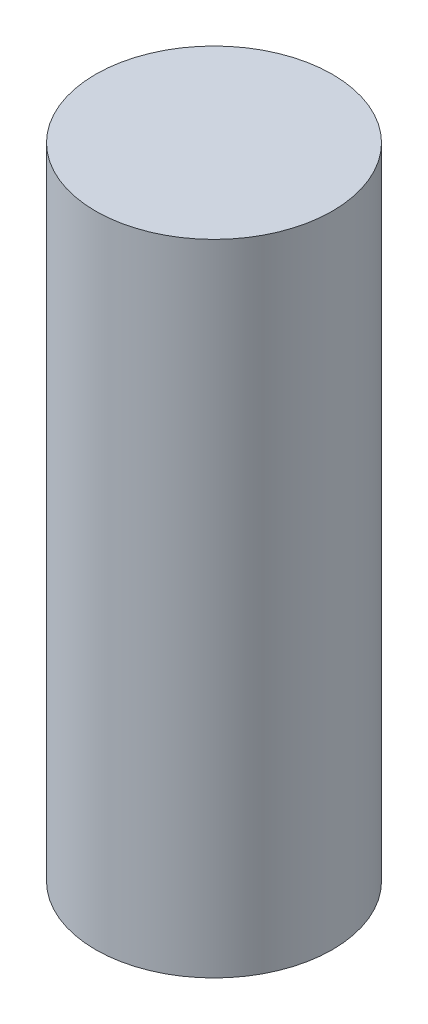
ISO-10303-21;
HEADER;
FILE_DESCRIPTION(('STEP AP214'),'2;1');
FILE_NAME('part.step','',(''),(''),'','','');
FILE_SCHEMA(('AUTOMOTIVE_DESIGN { 1 0 10303 214 1 1 1 1 }'));
ENDSEC;
DATA;
#1=APPLICATION_CONTEXT('core data for automotive mechanical design processes');
#2=APPLICATION_PROTOCOL_DEFINITION('international standard','automotive_design',2000,#1);
#3=PRODUCT_CONTEXT('',#1,'mechanical');
#4=PRODUCT('Part','Part','',(#3));
#5=PRODUCT_RELATED_PRODUCT_CATEGORY('part','',(#4));
#6=PRODUCT_DEFINITION_FORMATION('','',#4);
#7=PRODUCT_DEFINITION_CONTEXT('part definition',#1,'design');
#8=PRODUCT_DEFINITION('design','',#6,#7);
#9=PRODUCT_DEFINITION_SHAPE('','',#8);
#10=(LENGTH_UNIT() NAMED_UNIT(*) SI_UNIT(.MILLI.,.METRE.));
#11=(NAMED_UNIT(*) PLANE_ANGLE_UNIT() SI_UNIT($,.RADIAN.));
#12=(NAMED_UNIT(*) SI_UNIT($,.STERADIAN.) SOLID_ANGLE_UNIT());
#13=UNCERTAINTY_MEASURE_WITH_UNIT(LENGTH_MEASURE(1.E-05),#10,'distance_accuracy_value','');
#14=(GEOMETRIC_REPRESENTATION_CONTEXT(3) GLOBAL_UNCERTAINTY_ASSIGNED_CONTEXT((#13)) GLOBAL_UNIT_ASSIGNED_CONTEXT((#10,
#11,#12)) REPRESENTATION_CONTEXT('',''));
#15=CARTESIAN_POINT('',(0.,0.,0.));
#16=DIRECTION('',(0.,0.,1.));
#17=DIRECTION('',(1.,0.,0.));
#18=AXIS2_PLACEMENT_3D('',#15,#16,#17);
#19=CARTESIAN_POINT('',(0.,27.,0.));
#20=DIRECTION('',(0.,-1.,0.));
#21=DIRECTION('',(0.,0.,-1.));
#22=AXIS2_PLACEMENT_3D('',#19,#20,#21);
#23=CYLINDRICAL_SURFACE('',#22,5.);
#24=CARTESIAN_POINT('',(0.,27.,0.));
#25=DIRECTION('',(0.,1.,0.));
#26=DIRECTION('',(0.,0.,1.));
#27=AXIS2_PLACEMENT_3D('',#24,#25,#26);
#28=CIRCLE('',#27,5.);
#29=CARTESIAN_POINT('',(0.,27.,5.));
#30=VERTEX_POINT('',#29);
#31=EDGE_CURVE('E10',#30,#30,#28,.T.);
#32=ORIENTED_EDGE('',*,*,#31,.F.);
#33=EDGE_LOOP('',(#32));
#34=FACE_BOUND('',#33,.T.);
#35=CARTESIAN_POINT('',(0.,0.,0.));
#36=DIRECTION('',(0.,1.,0.));
#37=DIRECTION('',(0.,0.,1.));
#38=AXIS2_PLACEMENT_3D('',#35,#36,#37);
#39=CIRCLE('',#38,5.);
#40=CARTESIAN_POINT('',(0.,0.,5.));
#41=VERTEX_POINT('',#40);
#42=EDGE_CURVE('E34',#41,#41,#39,.T.);
#43=ORIENTED_EDGE('',*,*,#42,.T.);
#44=EDGE_LOOP('',(#43));
#45=FACE_BOUND('',#44,.T.);
#46=ADVANCED_FACE('F31',(#34,#45),#23,.T.);
#47=CARTESIAN_POINT('',(0.,27.,0.));
#48=DIRECTION('',(0.,1.,0.));
#49=DIRECTION('',(0.,0.,1.));
#50=AXIS2_PLACEMENT_3D('',#47,#48,#49);
#51=PLANE('',#50);
#52=ORIENTED_EDGE('',*,*,#31,.T.);
#53=EDGE_LOOP('',(#52));
#54=FACE_BOUND('',#53,.T.);
#55=ADVANCED_FACE('F46',(#54),#51,.T.);
#56=CARTESIAN_POINT('',(0.,0.,0.));
#57=DIRECTION('',(0.,1.,0.));
#58=DIRECTION('',(0.,0.,1.));
#59=AXIS2_PLACEMENT_3D('',#56,#57,#58);
#60=PLANE('',#59);
#61=ORIENTED_EDGE('',*,*,#42,.F.);
#62=EDGE_LOOP('',(#61));
#63=FACE_BOUND('',#62,.T.);
#64=ADVANCED_FACE('F44',(#63),#60,.F.);
#65=CLOSED_SHELL('',(#46,#55,#64));
#66=MANIFOLD_SOLID_BREP('B2',#65);
#67=ADVANCED_BREP_SHAPE_REPRESENTATION('',(#18,#66),#14);
#68=SHAPE_DEFINITION_REPRESENTATION(#9,#67);
ENDSEC;
END-ISO-10303-21;
